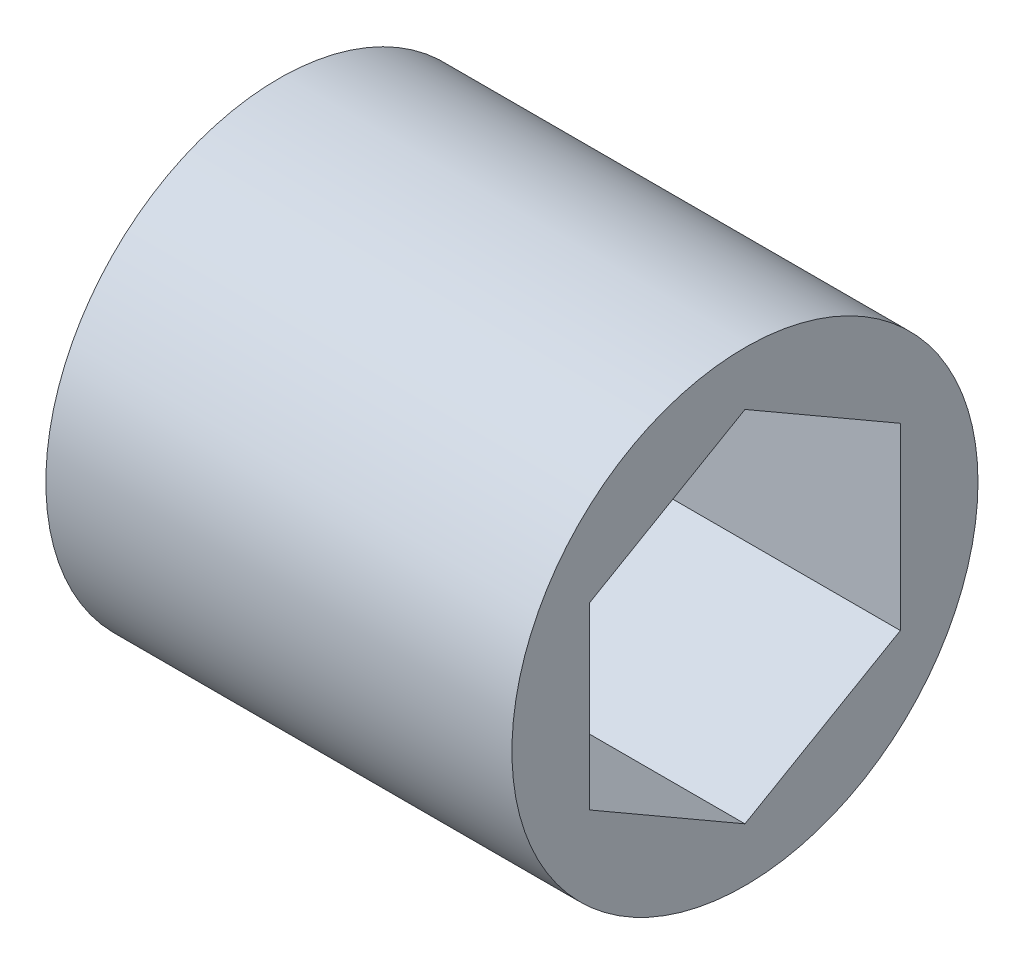
ISO-10303-21;
HEADER;
FILE_DESCRIPTION(('STEP AP214'),'2;1');
FILE_NAME('part.step','',(''),(''),'','','');
FILE_SCHEMA(('AUTOMOTIVE_DESIGN { 1 0 10303 214 1 1 1 1 }'));
ENDSEC;
DATA;
#1=APPLICATION_CONTEXT('core data for automotive mechanical design processes');
#2=APPLICATION_PROTOCOL_DEFINITION('international standard','automotive_design',2000,#1);
#3=PRODUCT_CONTEXT('',#1,'mechanical');
#4=PRODUCT('Part','Part','',(#3));
#5=PRODUCT_RELATED_PRODUCT_CATEGORY('part','',(#4));
#6=PRODUCT_DEFINITION_FORMATION('','',#4);
#7=PRODUCT_DEFINITION_CONTEXT('part definition',#1,'design');
#8=PRODUCT_DEFINITION('design','',#6,#7);
#9=PRODUCT_DEFINITION_SHAPE('','',#8);
#10=(LENGTH_UNIT() NAMED_UNIT(*) SI_UNIT(.MILLI.,.METRE.));
#11=(NAMED_UNIT(*) PLANE_ANGLE_UNIT() SI_UNIT($,.RADIAN.));
#12=(NAMED_UNIT(*) SI_UNIT($,.STERADIAN.) SOLID_ANGLE_UNIT());
#13=UNCERTAINTY_MEASURE_WITH_UNIT(LENGTH_MEASURE(1.E-05),#10,'distance_accuracy_value','');
#14=(GEOMETRIC_REPRESENTATION_CONTEXT(3) GLOBAL_UNCERTAINTY_ASSIGNED_CONTEXT((#13)) GLOBAL_UNIT_ASSIGNED_CONTEXT((#10,
#11,#12)) REPRESENTATION_CONTEXT('',''));
#15=CARTESIAN_POINT('',(0.,0.,0.));
#16=DIRECTION('',(0.,0.,1.));
#17=DIRECTION('',(1.,0.,0.));
#18=AXIS2_PLACEMENT_3D('',#15,#16,#17);
#19=CARTESIAN_POINT('',(12.7,0.,0.));
#20=DIRECTION('',(1.,0.,0.));
#21=DIRECTION('',(0.,0.,-1.));
#22=AXIS2_PLACEMENT_3D('',#19,#20,#21);
#23=PLANE('',#22);
#24=CARTESIAN_POINT('',(12.7,0.,0.));
#25=DIRECTION('',(1.,0.,0.));
#26=DIRECTION('',(0.,0.,-1.));
#27=AXIS2_PLACEMENT_3D('',#24,#25,#26);
#28=CIRCLE('',#27,6.35);
#29=CARTESIAN_POINT('',(12.7,0.,-6.35));
#30=VERTEX_POINT('',#29);
#31=EDGE_CURVE('E11',#30,#30,#28,.T.);
#32=ORIENTED_EDGE('',*,*,#31,.T.);
#33=EDGE_LOOP('',(#32));
#34=FACE_BOUND('',#33,.T.);
#35=DIRECTION('',(0.,0.5,-0.866025403784439));
#36=VECTOR('',#35,1.);
#37=CARTESIAN_POINT('',(12.7,-4.8895,0.));
#38=LINE('',#37,#36);
#39=CARTESIAN_POINT('',(12.7,-4.8895,0.));
#40=VERTEX_POINT('',#39);
#41=CARTESIAN_POINT('',(12.7,-2.44475,-4.23443121180401));
#42=VERTEX_POINT('',#41);
#43=EDGE_CURVE('E102',#40,#42,#38,.T.);
#44=ORIENTED_EDGE('',*,*,#43,.F.);
#45=DIRECTION('',(0.,-0.5,-0.866025403784439));
#46=VECTOR('',#45,1.);
#47=CARTESIAN_POINT('',(12.7,-2.44475,4.23443121180401));
#48=LINE('',#47,#46);
#49=CARTESIAN_POINT('',(12.7,-2.44475,4.23443121180401));
#50=VERTEX_POINT('',#49);
#51=EDGE_CURVE('E94',#50,#40,#48,.T.);
#52=ORIENTED_EDGE('',*,*,#51,.F.);
#53=DIRECTION('',(0.,-1.,0.));
#54=VECTOR('',#53,1.);
#55=CARTESIAN_POINT('',(12.7,2.44475,4.23443121180401));
#56=LINE('',#55,#54);
#57=CARTESIAN_POINT('',(12.7,2.44475,4.23443121180401));
#58=VERTEX_POINT('',#57);
#59=EDGE_CURVE('E122',#58,#50,#56,.T.);
#60=ORIENTED_EDGE('',*,*,#59,.F.);
#61=DIRECTION('',(0.,-0.5,0.866025403784439));
#62=VECTOR('',#61,1.);
#63=CARTESIAN_POINT('',(12.7,4.8895,0.));
#64=LINE('',#63,#62);
#65=CARTESIAN_POINT('',(12.7,4.8895,0.));
#66=VERTEX_POINT('',#65);
#67=EDGE_CURVE('E120',#66,#58,#64,.T.);
#68=ORIENTED_EDGE('',*,*,#67,.F.);
#69=DIRECTION('',(0.,0.5,0.866025403784439));
#70=VECTOR('',#69,1.);
#71=CARTESIAN_POINT('',(12.7,2.44475,-4.23443121180401));
#72=LINE('',#71,#70);
#73=CARTESIAN_POINT('',(12.7,2.44475,-4.23443121180401));
#74=VERTEX_POINT('',#73);
#75=EDGE_CURVE('E116',#74,#66,#72,.T.);
#76=ORIENTED_EDGE('',*,*,#75,.F.);
#77=DIRECTION('',(0.,1.,0.));
#78=VECTOR('',#77,1.);
#79=CARTESIAN_POINT('',(12.7,-2.44475,-4.23443121180401));
#80=LINE('',#79,#78);
#81=EDGE_CURVE('E114',#42,#74,#80,.T.);
#82=ORIENTED_EDGE('',*,*,#81,.F.);
#83=EDGE_LOOP('',(#44,#52,#60,#68,#76,#82));
#84=FACE_BOUND('',#83,.T.);
#85=ADVANCED_FACE('F41',(#34,#84),#23,.T.);
#86=CARTESIAN_POINT('',(0.,0.,0.));
#87=DIRECTION('',(1.,0.,0.));
#88=DIRECTION('',(0.,0.,-1.));
#89=AXIS2_PLACEMENT_3D('',#86,#87,#88);
#90=PLANE('',#89);
#91=CARTESIAN_POINT('',(0.,0.,0.));
#92=DIRECTION('',(1.,0.,0.));
#93=DIRECTION('',(0.,0.,-1.));
#94=AXIS2_PLACEMENT_3D('',#91,#92,#93);
#95=CIRCLE('',#94,6.35);
#96=CARTESIAN_POINT('',(0.,0.,-6.35));
#97=VERTEX_POINT('',#96);
#98=EDGE_CURVE('E45',#97,#97,#95,.T.);
#99=ORIENTED_EDGE('',*,*,#98,.F.);
#100=EDGE_LOOP('',(#99));
#101=FACE_BOUND('',#100,.T.);
#102=DIRECTION('',(0.,-0.5,-0.866025403784439));
#103=VECTOR('',#102,1.);
#104=CARTESIAN_POINT('',(0.,-2.44475,4.23443121180401));
#105=LINE('',#104,#103);
#106=CARTESIAN_POINT('',(0.,-2.44475,4.23443121180401));
#107=VERTEX_POINT('',#106);
#108=CARTESIAN_POINT('',(0.,-4.8895,0.));
#109=VERTEX_POINT('',#108);
#110=EDGE_CURVE('E64',#107,#109,#105,.T.);
#111=ORIENTED_EDGE('',*,*,#110,.T.);
#112=DIRECTION('',(0.,0.5,-0.866025403784439));
#113=VECTOR('',#112,1.);
#114=CARTESIAN_POINT('',(0.,-4.8895,0.));
#115=LINE('',#114,#113);
#116=CARTESIAN_POINT('',(0.,-2.44475,-4.23443121180401));
#117=VERTEX_POINT('',#116);
#118=EDGE_CURVE('E109',#109,#117,#115,.T.);
#119=ORIENTED_EDGE('',*,*,#118,.T.);
#120=DIRECTION('',(0.,1.,0.));
#121=VECTOR('',#120,1.);
#122=CARTESIAN_POINT('',(0.,-2.44475,-4.23443121180401));
#123=LINE('',#122,#121);
#124=CARTESIAN_POINT('',(0.,2.44475,-4.23443121180401));
#125=VERTEX_POINT('',#124);
#126=EDGE_CURVE('E126',#117,#125,#123,.T.);
#127=ORIENTED_EDGE('',*,*,#126,.T.);
#128=DIRECTION('',(0.,0.5,0.866025403784439));
#129=VECTOR('',#128,1.);
#130=CARTESIAN_POINT('',(0.,2.44475,-4.23443121180401));
#131=LINE('',#130,#129);
#132=CARTESIAN_POINT('',(0.,4.8895,0.));
#133=VERTEX_POINT('',#132);
#134=EDGE_CURVE('E129',#125,#133,#131,.T.);
#135=ORIENTED_EDGE('',*,*,#134,.T.);
#136=DIRECTION('',(0.,-0.5,0.866025403784439));
#137=VECTOR('',#136,1.);
#138=CARTESIAN_POINT('',(0.,4.8895,0.));
#139=LINE('',#138,#137);
#140=CARTESIAN_POINT('',(0.,2.44475,4.23443121180401));
#141=VERTEX_POINT('',#140);
#142=EDGE_CURVE('E132',#133,#141,#139,.T.);
#143=ORIENTED_EDGE('',*,*,#142,.T.);
#144=DIRECTION('',(0.,-1.,0.));
#145=VECTOR('',#144,1.);
#146=CARTESIAN_POINT('',(0.,2.44475,4.23443121180401));
#147=LINE('',#146,#145);
#148=EDGE_CURVE('E103',#141,#107,#147,.T.);
#149=ORIENTED_EDGE('',*,*,#148,.T.);
#150=EDGE_LOOP('',(#111,#119,#127,#135,#143,#149));
#151=FACE_BOUND('',#150,.T.);
#152=ADVANCED_FACE('F149',(#101,#151),#90,.F.);
#153=CARTESIAN_POINT('',(12.7,0.,0.));
#154=DIRECTION('',(-1.,0.,0.));
#155=DIRECTION('',(0.,0.,1.));
#156=AXIS2_PLACEMENT_3D('',#153,#154,#155);
#157=CYLINDRICAL_SURFACE('',#156,6.35);
#158=ORIENTED_EDGE('',*,*,#31,.F.);
#159=EDGE_LOOP('',(#158));
#160=FACE_BOUND('',#159,.T.);
#161=ORIENTED_EDGE('',*,*,#98,.T.);
#162=EDGE_LOOP('',(#161));
#163=FACE_BOUND('',#162,.T.);
#164=ADVANCED_FACE('F43',(#160,#163),#157,.T.);
#165=CARTESIAN_POINT('',(12.7,-2.44475,4.23443121180401));
#166=DIRECTION('',(0.,0.866025403784439,-0.5));
#167=DIRECTION('',(0.,0.5,0.866025403784439));
#168=AXIS2_PLACEMENT_3D('',#165,#166,#167);
#169=PLANE('',#168);
#170=ORIENTED_EDGE('',*,*,#110,.F.);
#171=DIRECTION('',(-1.,0.,0.));
#172=VECTOR('',#171,1.);
#173=CARTESIAN_POINT('',(12.7,-2.44475,4.23443121180401));
#174=LINE('',#173,#172);
#175=EDGE_CURVE('E98',#50,#107,#174,.T.);
#176=ORIENTED_EDGE('',*,*,#175,.F.);
#177=ORIENTED_EDGE('',*,*,#51,.T.);
#178=DIRECTION('',(-1.,0.,0.));
#179=VECTOR('',#178,1.);
#180=CARTESIAN_POINT('',(12.7,-4.8895,0.));
#181=LINE('',#180,#179);
#182=EDGE_CURVE('E97',#40,#109,#181,.T.);
#183=ORIENTED_EDGE('',*,*,#182,.T.);
#184=EDGE_LOOP('',(#170,#176,#177,#183));
#185=FACE_BOUND('',#184,.T.);
#186=ADVANCED_FACE('F96',(#185),#169,.T.);
#187=CARTESIAN_POINT('',(12.7,-4.8895,0.));
#188=DIRECTION('',(0.,0.866025403784439,0.5));
#189=DIRECTION('',(0.,-0.5,0.866025403784439));
#190=AXIS2_PLACEMENT_3D('',#187,#188,#189);
#191=PLANE('',#190);
#192=ORIENTED_EDGE('',*,*,#118,.F.);
#193=ORIENTED_EDGE('',*,*,#182,.F.);
#194=ORIENTED_EDGE('',*,*,#43,.T.);
#195=DIRECTION('',(-1.,0.,0.));
#196=VECTOR('',#195,1.);
#197=CARTESIAN_POINT('',(12.7,-2.44475,-4.23443121180401));
#198=LINE('',#197,#196);
#199=EDGE_CURVE('E110',#42,#117,#198,.T.);
#200=ORIENTED_EDGE('',*,*,#199,.T.);
#201=EDGE_LOOP('',(#192,#193,#194,#200));
#202=FACE_BOUND('',#201,.T.);
#203=ADVANCED_FACE('F106',(#202),#191,.T.);
#204=CARTESIAN_POINT('',(12.7,-2.44475,-4.23443121180401));
#205=DIRECTION('',(0.,0.,1.));
#206=DIRECTION('',(0.,-1.,0.));
#207=AXIS2_PLACEMENT_3D('',#204,#205,#206);
#208=PLANE('',#207);
#209=ORIENTED_EDGE('',*,*,#126,.F.);
#210=ORIENTED_EDGE('',*,*,#199,.F.);
#211=ORIENTED_EDGE('',*,*,#81,.T.);
#212=DIRECTION('',(-1.,0.,0.));
#213=VECTOR('',#212,1.);
#214=CARTESIAN_POINT('',(12.7,2.44475,-4.23443121180401));
#215=LINE('',#214,#213);
#216=EDGE_CURVE('E141',#74,#125,#215,.T.);
#217=ORIENTED_EDGE('',*,*,#216,.T.);
#218=EDGE_LOOP('',(#209,#210,#211,#217));
#219=FACE_BOUND('',#218,.T.);
#220=ADVANCED_FACE('F145',(#219),#208,.T.);
#221=CARTESIAN_POINT('',(12.7,2.44475,-4.23443121180401));
#222=DIRECTION('',(0.,-0.866025403784439,0.5));
#223=DIRECTION('',(0.,-0.5,-0.866025403784439));
#224=AXIS2_PLACEMENT_3D('',#221,#222,#223);
#225=PLANE('',#224);
#226=ORIENTED_EDGE('',*,*,#134,.F.);
#227=ORIENTED_EDGE('',*,*,#216,.F.);
#228=ORIENTED_EDGE('',*,*,#75,.T.);
#229=DIRECTION('',(-1.,0.,0.));
#230=VECTOR('',#229,1.);
#231=CARTESIAN_POINT('',(12.7,4.8895,0.));
#232=LINE('',#231,#230);
#233=EDGE_CURVE('E139',#66,#133,#232,.T.);
#234=ORIENTED_EDGE('',*,*,#233,.T.);
#235=EDGE_LOOP('',(#226,#227,#228,#234));
#236=FACE_BOUND('',#235,.T.);
#237=ADVANCED_FACE('F157',(#236),#225,.T.);
#238=CARTESIAN_POINT('',(12.7,4.8895,0.));
#239=DIRECTION('',(0.,-0.866025403784439,-0.5));
#240=DIRECTION('',(0.,0.5,-0.866025403784439));
#241=AXIS2_PLACEMENT_3D('',#238,#239,#240);
#242=PLANE('',#241);
#243=ORIENTED_EDGE('',*,*,#142,.F.);
#244=ORIENTED_EDGE('',*,*,#233,.F.);
#245=ORIENTED_EDGE('',*,*,#67,.T.);
#246=DIRECTION('',(-1.,0.,0.));
#247=VECTOR('',#246,1.);
#248=CARTESIAN_POINT('',(12.7,2.44475,4.23443121180401));
#249=LINE('',#248,#247);
#250=EDGE_CURVE('E56',#58,#141,#249,.T.);
#251=ORIENTED_EDGE('',*,*,#250,.T.);
#252=EDGE_LOOP('',(#243,#244,#245,#251));
#253=FACE_BOUND('',#252,.T.);
#254=ADVANCED_FACE('F155',(#253),#242,.T.);
#255=CARTESIAN_POINT('',(12.7,2.44475,4.23443121180401));
#256=DIRECTION('',(0.,0.,-1.));
#257=DIRECTION('',(-1.,0.,0.));
#258=AXIS2_PLACEMENT_3D('',#255,#256,#257);
#259=PLANE('',#258);
#260=ORIENTED_EDGE('',*,*,#148,.F.);
#261=ORIENTED_EDGE('',*,*,#250,.F.);
#262=ORIENTED_EDGE('',*,*,#59,.T.);
#263=ORIENTED_EDGE('',*,*,#175,.T.);
#264=EDGE_LOOP('',(#260,#261,#262,#263));
#265=FACE_BOUND('',#264,.T.);
#266=ADVANCED_FACE('F151',(#265),#259,.T.);
#267=CLOSED_SHELL('',(#85,#152,#164,#186,#203,#220,#237,#254,#266));
#268=MANIFOLD_SOLID_BREP('B2',#267);
#269=ADVANCED_BREP_SHAPE_REPRESENTATION('',(#18,#268),#14);
#270=SHAPE_DEFINITION_REPRESENTATION(#9,#269);
ENDSEC;
END-ISO-10303-21;
